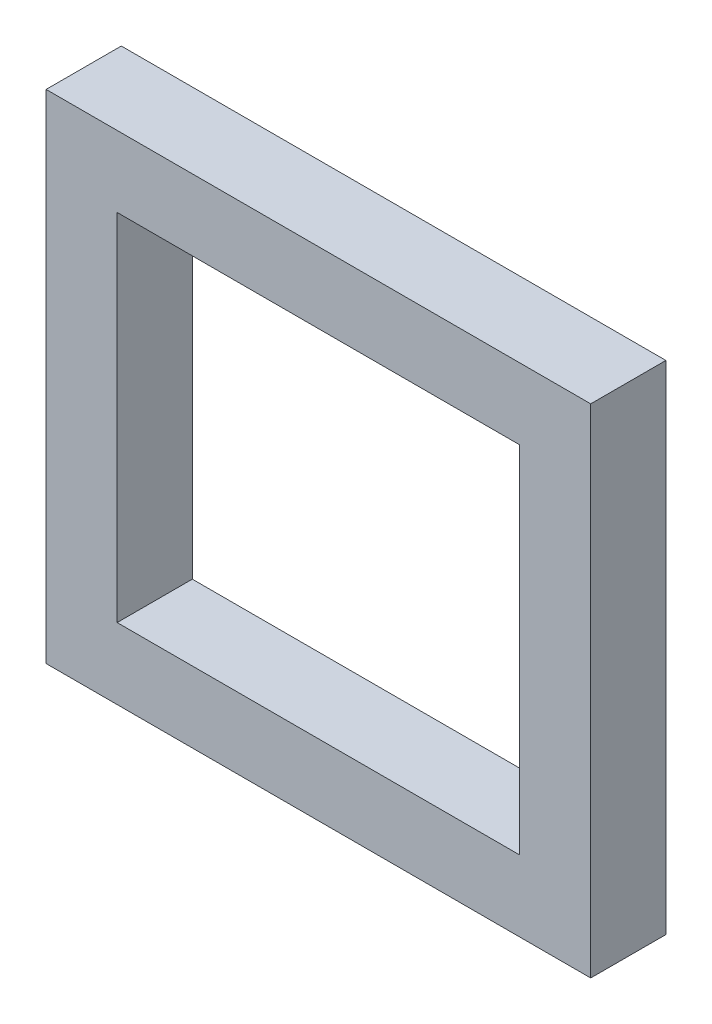
ISO-10303-21;
HEADER;
FILE_DESCRIPTION(('STEP AP214'),'2;1');
FILE_NAME('part.step','',(''),(''),'','','');
FILE_SCHEMA(('AUTOMOTIVE_DESIGN { 1 0 10303 214 1 1 1 1 }'));
ENDSEC;
DATA;
#1=APPLICATION_CONTEXT('core data for automotive mechanical design processes');
#2=APPLICATION_PROTOCOL_DEFINITION('international standard','automotive_design',2000,#1);
#3=PRODUCT_CONTEXT('',#1,'mechanical');
#4=PRODUCT('Part','Part','',(#3));
#5=PRODUCT_RELATED_PRODUCT_CATEGORY('part','',(#4));
#6=PRODUCT_DEFINITION_FORMATION('','',#4);
#7=PRODUCT_DEFINITION_CONTEXT('part definition',#1,'design');
#8=PRODUCT_DEFINITION('design','',#6,#7);
#9=PRODUCT_DEFINITION_SHAPE('','',#8);
#10=(LENGTH_UNIT() NAMED_UNIT(*) SI_UNIT(.MILLI.,.METRE.));
#11=(NAMED_UNIT(*) PLANE_ANGLE_UNIT() SI_UNIT($,.RADIAN.));
#12=(NAMED_UNIT(*) SI_UNIT($,.STERADIAN.) SOLID_ANGLE_UNIT());
#13=UNCERTAINTY_MEASURE_WITH_UNIT(LENGTH_MEASURE(1.E-05),#10,'distance_accuracy_value','');
#14=(GEOMETRIC_REPRESENTATION_CONTEXT(3) GLOBAL_UNCERTAINTY_ASSIGNED_CONTEXT((#13)) GLOBAL_UNIT_ASSIGNED_CONTEXT((#10,
#11,#12)) REPRESENTATION_CONTEXT('',''));
#15=CARTESIAN_POINT('',(0.,0.,0.));
#16=DIRECTION('',(0.,0.,1.));
#17=DIRECTION('',(1.,0.,0.));
#18=AXIS2_PLACEMENT_3D('',#15,#16,#17);
#19=CARTESIAN_POINT('',(0.,0.,3.175));
#20=DIRECTION('',(0.,0.,-1.));
#21=DIRECTION('',(-1.,0.,0.));
#22=AXIS2_PLACEMENT_3D('',#19,#20,#21);
#23=PLANE('',#22);
#24=DIRECTION('',(0.,1.,0.));
#25=VECTOR('',#24,1.);
#26=CARTESIAN_POINT('',(11.5,-10.5,3.175));
#27=LINE('',#26,#25);
#28=CARTESIAN_POINT('',(11.5,-10.5,3.175));
#29=VERTEX_POINT('',#28);
#30=CARTESIAN_POINT('',(11.5,10.5,3.175));
#31=VERTEX_POINT('',#30);
#32=EDGE_CURVE('E155',#29,#31,#27,.T.);
#33=ORIENTED_EDGE('',*,*,#32,.T.);
#34=DIRECTION('',(-1.,0.,0.));
#35=VECTOR('',#34,1.);
#36=CARTESIAN_POINT('',(-11.5,10.5,3.175));
#37=LINE('',#36,#35);
#38=CARTESIAN_POINT('',(-11.5,10.5,3.175));
#39=VERTEX_POINT('',#38);
#40=EDGE_CURVE('E159',#31,#39,#37,.T.);
#41=ORIENTED_EDGE('',*,*,#40,.T.);
#42=DIRECTION('',(0.,-1.,0.));
#43=VECTOR('',#42,1.);
#44=CARTESIAN_POINT('',(-11.5,-10.5,3.175));
#45=LINE('',#44,#43);
#46=CARTESIAN_POINT('',(-11.5,-10.5,3.175));
#47=VERTEX_POINT('',#46);
#48=EDGE_CURVE('E163',#39,#47,#45,.T.);
#49=ORIENTED_EDGE('',*,*,#48,.T.);
#50=DIRECTION('',(1.,0.,0.));
#51=VECTOR('',#50,1.);
#52=CARTESIAN_POINT('',(-11.5,-10.5,3.175));
#53=LINE('',#52,#51);
#54=EDGE_CURVE('E166',#47,#29,#53,.T.);
#55=ORIENTED_EDGE('',*,*,#54,.T.);
#56=EDGE_LOOP('',(#33,#41,#49,#55));
#57=FACE_BOUND('',#56,.T.);
#58=DIRECTION('',(0.,1.,0.));
#59=VECTOR('',#58,1.);
#60=CARTESIAN_POINT('',(8.5,-7.5,3.175));
#61=LINE('',#60,#59);
#62=CARTESIAN_POINT('',(8.5,-7.5,3.175));
#63=VERTEX_POINT('',#62);
#64=CARTESIAN_POINT('',(8.5,7.5,3.175));
#65=VERTEX_POINT('',#64);
#66=EDGE_CURVE('E107',#63,#65,#61,.T.);
#67=ORIENTED_EDGE('',*,*,#66,.F.);
#68=DIRECTION('',(1.,0.,0.));
#69=VECTOR('',#68,1.);
#70=CARTESIAN_POINT('',(-8.5,-7.5,3.175));
#71=LINE('',#70,#69);
#72=CARTESIAN_POINT('',(-8.5,-7.5,3.175));
#73=VERTEX_POINT('',#72);
#74=EDGE_CURVE('E133',#73,#63,#71,.T.);
#75=ORIENTED_EDGE('',*,*,#74,.F.);
#76=DIRECTION('',(0.,-1.,0.));
#77=VECTOR('',#76,1.);
#78=CARTESIAN_POINT('',(-8.5,-7.5,3.175));
#79=LINE('',#78,#77);
#80=CARTESIAN_POINT('',(-8.5,7.5,3.175));
#81=VERTEX_POINT('',#80);
#82=EDGE_CURVE('E129',#81,#73,#79,.T.);
#83=ORIENTED_EDGE('',*,*,#82,.F.);
#84=DIRECTION('',(-1.,0.,0.));
#85=VECTOR('',#84,1.);
#86=CARTESIAN_POINT('',(-8.5,7.5,3.175));
#87=LINE('',#86,#85);
#88=EDGE_CURVE('E116',#65,#81,#87,.T.);
#89=ORIENTED_EDGE('',*,*,#88,.F.);
#90=EDGE_LOOP('',(#67,#75,#83,#89));
#91=FACE_BOUND('',#90,.T.);
#92=ADVANCED_FACE('F41',(#57,#91),#23,.F.);
#93=CARTESIAN_POINT('',(0.,0.,0.));
#94=DIRECTION('',(0.,0.,-1.));
#95=DIRECTION('',(-1.,0.,0.));
#96=AXIS2_PLACEMENT_3D('',#93,#94,#95);
#97=PLANE('',#96);
#98=DIRECTION('',(0.,1.,0.));
#99=VECTOR('',#98,1.);
#100=CARTESIAN_POINT('',(11.5,-10.5,0.));
#101=LINE('',#100,#99);
#102=CARTESIAN_POINT('',(11.5,-10.5,0.));
#103=VERTEX_POINT('',#102);
#104=CARTESIAN_POINT('',(11.5,10.5,0.));
#105=VERTEX_POINT('',#104);
#106=EDGE_CURVE('E125',#103,#105,#101,.T.);
#107=ORIENTED_EDGE('',*,*,#106,.F.);
#108=DIRECTION('',(1.,0.,0.));
#109=VECTOR('',#108,1.);
#110=CARTESIAN_POINT('',(-11.5,-10.5,0.));
#111=LINE('',#110,#109);
#112=CARTESIAN_POINT('',(-11.5,-10.5,0.));
#113=VERTEX_POINT('',#112);
#114=EDGE_CURVE('E160',#113,#103,#111,.T.);
#115=ORIENTED_EDGE('',*,*,#114,.F.);
#116=DIRECTION('',(0.,-1.,0.));
#117=VECTOR('',#116,1.);
#118=CARTESIAN_POINT('',(-11.5,-10.5,0.));
#119=LINE('',#118,#117);
#120=CARTESIAN_POINT('',(-11.5,10.5,0.));
#121=VERTEX_POINT('',#120);
#122=EDGE_CURVE('E176',#121,#113,#119,.T.);
#123=ORIENTED_EDGE('',*,*,#122,.F.);
#124=DIRECTION('',(-1.,0.,0.));
#125=VECTOR('',#124,1.);
#126=CARTESIAN_POINT('',(-11.5,10.5,0.));
#127=LINE('',#126,#125);
#128=EDGE_CURVE('E173',#105,#121,#127,.T.);
#129=ORIENTED_EDGE('',*,*,#128,.F.);
#130=EDGE_LOOP('',(#107,#115,#123,#129));
#131=FACE_BOUND('',#130,.T.);
#132=DIRECTION('',(1.,0.,0.));
#133=VECTOR('',#132,1.);
#134=CARTESIAN_POINT('',(-8.5,-7.5,0.));
#135=LINE('',#134,#133);
#136=CARTESIAN_POINT('',(-8.5,-7.5,0.));
#137=VERTEX_POINT('',#136);
#138=CARTESIAN_POINT('',(8.5,-7.5,0.));
#139=VERTEX_POINT('',#138);
#140=EDGE_CURVE('E117',#137,#139,#135,.T.);
#141=ORIENTED_EDGE('',*,*,#140,.T.);
#142=DIRECTION('',(0.,1.,0.));
#143=VECTOR('',#142,1.);
#144=CARTESIAN_POINT('',(8.5,-7.5,0.));
#145=LINE('',#144,#143);
#146=CARTESIAN_POINT('',(8.5,7.5,0.));
#147=VERTEX_POINT('',#146);
#148=EDGE_CURVE('E65',#139,#147,#145,.T.);
#149=ORIENTED_EDGE('',*,*,#148,.T.);
#150=DIRECTION('',(-1.,0.,0.));
#151=VECTOR('',#150,1.);
#152=CARTESIAN_POINT('',(-8.5,7.5,0.));
#153=LINE('',#152,#151);
#154=CARTESIAN_POINT('',(-8.5,7.5,0.));
#155=VERTEX_POINT('',#154);
#156=EDGE_CURVE('E123',#147,#155,#153,.T.);
#157=ORIENTED_EDGE('',*,*,#156,.T.);
#158=DIRECTION('',(0.,-1.,0.));
#159=VECTOR('',#158,1.);
#160=CARTESIAN_POINT('',(-8.5,-7.5,0.));
#161=LINE('',#160,#159);
#162=EDGE_CURVE('E142',#155,#137,#161,.T.);
#163=ORIENTED_EDGE('',*,*,#162,.T.);
#164=EDGE_LOOP('',(#141,#149,#157,#163));
#165=FACE_BOUND('',#164,.T.);
#166=ADVANCED_FACE('F199',(#131,#165),#97,.T.);
#167=CARTESIAN_POINT('',(11.5,-10.5,3.175));
#168=DIRECTION('',(-1.,0.,0.));
#169=DIRECTION('',(0.,0.,1.));
#170=AXIS2_PLACEMENT_3D('',#167,#168,#169);
#171=PLANE('',#170);
#172=ORIENTED_EDGE('',*,*,#106,.T.);
#173=DIRECTION('',(0.,0.,-1.));
#174=VECTOR('',#173,1.);
#175=CARTESIAN_POINT('',(11.5,10.5,3.175));
#176=LINE('',#175,#174);
#177=EDGE_CURVE('E11',#31,#105,#176,.T.);
#178=ORIENTED_EDGE('',*,*,#177,.F.);
#179=ORIENTED_EDGE('',*,*,#32,.F.);
#180=DIRECTION('',(0.,0.,-1.));
#181=VECTOR('',#180,1.);
#182=CARTESIAN_POINT('',(11.5,-10.5,3.175));
#183=LINE('',#182,#181);
#184=EDGE_CURVE('E169',#29,#103,#183,.T.);
#185=ORIENTED_EDGE('',*,*,#184,.T.);
#186=EDGE_LOOP('',(#172,#178,#179,#185));
#187=FACE_BOUND('',#186,.T.);
#188=ADVANCED_FACE('F43',(#187),#171,.F.);
#189=CARTESIAN_POINT('',(-11.5,10.5,3.175));
#190=DIRECTION('',(0.,-1.,0.));
#191=DIRECTION('',(0.,0.,-1.));
#192=AXIS2_PLACEMENT_3D('',#189,#190,#191);
#193=PLANE('',#192);
#194=ORIENTED_EDGE('',*,*,#128,.T.);
#195=DIRECTION('',(0.,0.,-1.));
#196=VECTOR('',#195,1.);
#197=CARTESIAN_POINT('',(-11.5,10.5,3.175));
#198=LINE('',#197,#196);
#199=EDGE_CURVE('E50',#39,#121,#198,.T.);
#200=ORIENTED_EDGE('',*,*,#199,.F.);
#201=ORIENTED_EDGE('',*,*,#40,.F.);
#202=ORIENTED_EDGE('',*,*,#177,.T.);
#203=EDGE_LOOP('',(#194,#200,#201,#202));
#204=FACE_BOUND('',#203,.T.);
#205=ADVANCED_FACE('F209',(#204),#193,.F.);
#206=CARTESIAN_POINT('',(-11.5,-10.5,3.175));
#207=DIRECTION('',(1.,0.,0.));
#208=DIRECTION('',(0.,0.,-1.));
#209=AXIS2_PLACEMENT_3D('',#206,#207,#208);
#210=PLANE('',#209);
#211=ORIENTED_EDGE('',*,*,#122,.T.);
#212=DIRECTION('',(0.,0.,-1.));
#213=VECTOR('',#212,1.);
#214=CARTESIAN_POINT('',(-11.5,-10.5,3.175));
#215=LINE('',#214,#213);
#216=EDGE_CURVE('E184',#47,#113,#215,.T.);
#217=ORIENTED_EDGE('',*,*,#216,.F.);
#218=ORIENTED_EDGE('',*,*,#48,.F.);
#219=ORIENTED_EDGE('',*,*,#199,.T.);
#220=EDGE_LOOP('',(#211,#217,#218,#219));
#221=FACE_BOUND('',#220,.T.);
#222=ADVANCED_FACE('F193',(#221),#210,.F.);
#223=CARTESIAN_POINT('',(-11.5,-10.5,3.175));
#224=DIRECTION('',(0.,1.,0.));
#225=DIRECTION('',(-1.,0.,0.));
#226=AXIS2_PLACEMENT_3D('',#223,#224,#225);
#227=PLANE('',#226);
#228=ORIENTED_EDGE('',*,*,#114,.T.);
#229=ORIENTED_EDGE('',*,*,#184,.F.);
#230=ORIENTED_EDGE('',*,*,#54,.F.);
#231=ORIENTED_EDGE('',*,*,#216,.T.);
#232=EDGE_LOOP('',(#228,#229,#230,#231));
#233=FACE_BOUND('',#232,.T.);
#234=ADVANCED_FACE('F203',(#233),#227,.F.);
#235=CARTESIAN_POINT('',(8.5,-7.5,3.175));
#236=DIRECTION('',(-1.,0.,0.));
#237=DIRECTION('',(0.,0.,1.));
#238=AXIS2_PLACEMENT_3D('',#235,#236,#237);
#239=PLANE('',#238);
#240=ORIENTED_EDGE('',*,*,#148,.F.);
#241=DIRECTION('',(0.,0.,-1.));
#242=VECTOR('',#241,1.);
#243=CARTESIAN_POINT('',(8.5,-7.5,3.175));
#244=LINE('',#243,#242);
#245=EDGE_CURVE('E111',#63,#139,#244,.T.);
#246=ORIENTED_EDGE('',*,*,#245,.F.);
#247=ORIENTED_EDGE('',*,*,#66,.T.);
#248=DIRECTION('',(0.,0.,-1.));
#249=VECTOR('',#248,1.);
#250=CARTESIAN_POINT('',(8.5,7.5,3.175));
#251=LINE('',#250,#249);
#252=EDGE_CURVE('E110',#65,#147,#251,.T.);
#253=ORIENTED_EDGE('',*,*,#252,.T.);
#254=EDGE_LOOP('',(#240,#246,#247,#253));
#255=FACE_BOUND('',#254,.T.);
#256=ADVANCED_FACE('F109',(#255),#239,.T.);
#257=CARTESIAN_POINT('',(-8.5,7.5,3.175));
#258=DIRECTION('',(0.,-1.,0.));
#259=DIRECTION('',(0.,0.,-1.));
#260=AXIS2_PLACEMENT_3D('',#257,#258,#259);
#261=PLANE('',#260);
#262=ORIENTED_EDGE('',*,*,#156,.F.);
#263=ORIENTED_EDGE('',*,*,#252,.F.);
#264=ORIENTED_EDGE('',*,*,#88,.T.);
#265=DIRECTION('',(0.,0.,-1.));
#266=VECTOR('',#265,1.);
#267=CARTESIAN_POINT('',(-8.5,7.5,3.175));
#268=LINE('',#267,#266);
#269=EDGE_CURVE('E126',#81,#155,#268,.T.);
#270=ORIENTED_EDGE('',*,*,#269,.T.);
#271=EDGE_LOOP('',(#262,#263,#264,#270));
#272=FACE_BOUND('',#271,.T.);
#273=ADVANCED_FACE('F120',(#272),#261,.T.);
#274=CARTESIAN_POINT('',(-8.5,-7.5,3.175));
#275=DIRECTION('',(1.,0.,0.));
#276=DIRECTION('',(0.,0.,-1.));
#277=AXIS2_PLACEMENT_3D('',#274,#275,#276);
#278=PLANE('',#277);
#279=ORIENTED_EDGE('',*,*,#162,.F.);
#280=ORIENTED_EDGE('',*,*,#269,.F.);
#281=ORIENTED_EDGE('',*,*,#82,.T.);
#282=DIRECTION('',(0.,0.,-1.));
#283=VECTOR('',#282,1.);
#284=CARTESIAN_POINT('',(-8.5,-7.5,3.175));
#285=LINE('',#284,#283);
#286=EDGE_CURVE('E57',#73,#137,#285,.T.);
#287=ORIENTED_EDGE('',*,*,#286,.T.);
#288=EDGE_LOOP('',(#279,#280,#281,#287));
#289=FACE_BOUND('',#288,.T.);
#290=ADVANCED_FACE('F232',(#289),#278,.T.);
#291=CARTESIAN_POINT('',(-8.5,-7.5,3.175));
#292=DIRECTION('',(0.,1.,0.));
#293=DIRECTION('',(0.,0.,1.));
#294=AXIS2_PLACEMENT_3D('',#291,#292,#293);
#295=PLANE('',#294);
#296=ORIENTED_EDGE('',*,*,#140,.F.);
#297=ORIENTED_EDGE('',*,*,#286,.F.);
#298=ORIENTED_EDGE('',*,*,#74,.T.);
#299=ORIENTED_EDGE('',*,*,#245,.T.);
#300=EDGE_LOOP('',(#296,#297,#298,#299));
#301=FACE_BOUND('',#300,.T.);
#302=ADVANCED_FACE('F236',(#301),#295,.T.);
#303=CLOSED_SHELL('',(#92,#166,#188,#205,#222,#234,#256,#273,#290,#302));
#304=MANIFOLD_SOLID_BREP('B2',#303);
#305=ADVANCED_BREP_SHAPE_REPRESENTATION('',(#18,#304),#14);
#306=SHAPE_DEFINITION_REPRESENTATION(#9,#305);
ENDSEC;
END-ISO-10303-21;
